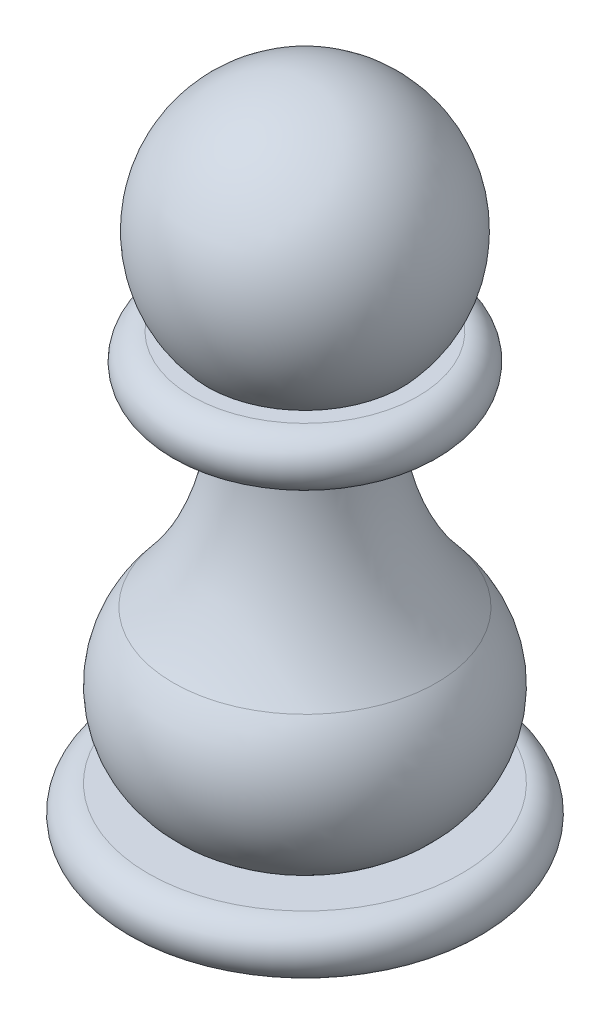
ISO-10303-21;
HEADER;
FILE_DESCRIPTION(('STEP AP214'),'2;1');
FILE_NAME('part.step','',(''),(''),'','','');
FILE_SCHEMA(('AUTOMOTIVE_DESIGN { 1 0 10303 214 1 1 1 1 }'));
ENDSEC;
DATA;
#1=APPLICATION_CONTEXT('core data for automotive mechanical design processes');
#2=APPLICATION_PROTOCOL_DEFINITION('international standard','automotive_design',2000,#1);
#3=PRODUCT_CONTEXT('',#1,'mechanical');
#4=PRODUCT('Part','Part','',(#3));
#5=PRODUCT_RELATED_PRODUCT_CATEGORY('part','',(#4));
#6=PRODUCT_DEFINITION_FORMATION('','',#4);
#7=PRODUCT_DEFINITION_CONTEXT('part definition',#1,'design');
#8=PRODUCT_DEFINITION('design','',#6,#7);
#9=PRODUCT_DEFINITION_SHAPE('','',#8);
#10=(LENGTH_UNIT() NAMED_UNIT(*) SI_UNIT(.MILLI.,.METRE.));
#11=(NAMED_UNIT(*) PLANE_ANGLE_UNIT() SI_UNIT($,.RADIAN.));
#12=(NAMED_UNIT(*) SI_UNIT($,.STERADIAN.) SOLID_ANGLE_UNIT());
#13=UNCERTAINTY_MEASURE_WITH_UNIT(LENGTH_MEASURE(1.E-05),#10,'distance_accuracy_value','');
#14=(GEOMETRIC_REPRESENTATION_CONTEXT(3) GLOBAL_UNCERTAINTY_ASSIGNED_CONTEXT((#13)) GLOBAL_UNIT_ASSIGNED_CONTEXT((#10,
#11,#12)) REPRESENTATION_CONTEXT('',''));
#15=CARTESIAN_POINT('',(0.,0.,0.));
#16=DIRECTION('',(0.,0.,1.));
#17=DIRECTION('',(1.,0.,0.));
#18=AXIS2_PLACEMENT_3D('',#15,#16,#17);
#19=CARTESIAN_POINT('',(0.,-7.5,0.));
#20=DIRECTION('',(0.,1.,0.));
#21=DIRECTION('',(0.,0.,-1.));
#22=AXIS2_PLACEMENT_3D('',#19,#20,#21);
#23=SPHERICAL_SURFACE('',#22,7.5);
#24=CARTESIAN_POINT('',(0.,-12.5,0.));
#25=DIRECTION('',(0.,1.,0.));
#26=DIRECTION('',(0.,0.,1.));
#27=AXIS2_PLACEMENT_3D('',#24,#25,#26);
#28=CIRCLE('',#27,5.59016994374947);
#29=CARTESIAN_POINT('',(0.,-12.5,5.59016994374947));
#30=VERTEX_POINT('',#29);
#31=EDGE_CURVE('E58',#30,#30,#28,.T.);
#32=ORIENTED_EDGE('',*,*,#31,.T.);
#33=EDGE_LOOP('',(#32));
#34=FACE_BOUND('',#33,.T.);
#35=ADVANCED_FACE('F30',(#34),#23,.T.);
#36=CARTESIAN_POINT('',(0.,-38.,0.));
#37=DIRECTION('',(0.,1.,0.));
#38=DIRECTION('',(0.,0.,1.));
#39=AXIS2_PLACEMENT_3D('',#36,#37,#38);
#40=PLANE('',#39);
#41=CARTESIAN_POINT('',(0.,-38.,0.));
#42=DIRECTION('',(0.,1.,0.));
#43=DIRECTION('',(0.,0.,1.));
#44=AXIS2_PLACEMENT_3D('',#41,#42,#43);
#45=CIRCLE('',#44,9.);
#46=CARTESIAN_POINT('',(0.,-38.,8.99999999999999));
#47=VERTEX_POINT('',#46);
#48=EDGE_CURVE('E10',#47,#47,#45,.T.);
#49=ORIENTED_EDGE('',*,*,#48,.F.);
#50=EDGE_LOOP('',(#49));
#51=FACE_BOUND('',#50,.T.);
#52=ADVANCED_FACE('F100',(#51),#40,.F.);
#53=CARTESIAN_POINT('',(0.,-36.5,0.));
#54=DIRECTION('',(0.,1.,0.));
#55=DIRECTION('',(0.,0.,1.));
#56=AXIS2_PLACEMENT_3D('',#53,#54,#55);
#57=TOROIDAL_SURFACE('',#56,9.,1.5);
#58=CARTESIAN_POINT('',(0.,-35.,0.));
#59=DIRECTION('',(0.,1.,0.));
#60=DIRECTION('',(0.,0.,1.));
#61=AXIS2_PLACEMENT_3D('',#58,#59,#60);
#62=CIRCLE('',#61,9.);
#63=CARTESIAN_POINT('',(0.,-35.,9.));
#64=VERTEX_POINT('',#63);
#65=EDGE_CURVE('E36',#64,#64,#62,.T.);
#66=ORIENTED_EDGE('',*,*,#65,.F.);
#67=EDGE_LOOP('',(#66));
#68=FACE_BOUND('',#67,.T.);
#69=ORIENTED_EDGE('',*,*,#48,.T.);
#70=EDGE_LOOP('',(#69));
#71=FACE_BOUND('',#70,.T.);
#72=ADVANCED_FACE('F95',(#68,#71),#57,.T.);
#73=CARTESIAN_POINT('',(0.,-35.,-9.00000000000001));
#74=DIRECTION('',(0.,-1.,0.));
#75=DIRECTION('',(0.,0.,-1.));
#76=AXIS2_PLACEMENT_3D('',#73,#74,#75);
#77=PLANE('',#76);
#78=CARTESIAN_POINT('',(0.,-35.,0.));
#79=DIRECTION('',(0.,1.,0.));
#80=DIRECTION('',(0.,0.,1.));
#81=AXIS2_PLACEMENT_3D('',#78,#79,#80);
#82=CIRCLE('',#81,6.5);
#83=CARTESIAN_POINT('',(0.,-35.,6.5));
#84=VERTEX_POINT('',#83);
#85=EDGE_CURVE('E40',#84,#84,#82,.T.);
#86=ORIENTED_EDGE('',*,*,#85,.F.);
#87=EDGE_LOOP('',(#86));
#88=FACE_BOUND('',#87,.T.);
#89=ORIENTED_EDGE('',*,*,#65,.T.);
#90=EDGE_LOOP('',(#89));
#91=FACE_BOUND('',#90,.T.);
#92=ADVANCED_FACE('F90',(#88,#91),#77,.F.);
#93=CARTESIAN_POINT('',(0.,-30.1266028275955,0.));
#94=DIRECTION('',(0.,1.,0.));
#95=DIRECTION('',(0.,0.,1.));
#96=AXIS2_PLACEMENT_3D('',#93,#94,#95);
#97=DEGENERATE_TOROIDAL_SURFACE('',#96,3.,6.,.T.);
#98=CARTESIAN_POINT('',(0.,-26.2295693766869,0.));
#99=DIRECTION('',(0.,1.,0.));
#100=DIRECTION('',(0.,0.,1.));
#101=AXIS2_PLACEMENT_3D('',#98,#99,#100);
#102=CIRCLE('',#101,7.56214097573703);
#103=CARTESIAN_POINT('',(0.,-26.2295693766869,7.56214097573703));
#104=VERTEX_POINT('',#103);
#105=EDGE_CURVE('E44',#104,#104,#102,.T.);
#106=ORIENTED_EDGE('',*,*,#105,.F.);
#107=EDGE_LOOP('',(#106));
#108=FACE_BOUND('',#107,.T.);
#109=ORIENTED_EDGE('',*,*,#85,.T.);
#110=EDGE_LOOP('',(#109));
#111=FACE_BOUND('',#110,.T.);
#112=ADVANCED_FACE('F84',(#108,#111),#97,.T.);
#113=CARTESIAN_POINT('',(0.,-16.4869857494152,0.));
#114=DIRECTION('',(0.,1.,0.));
#115=DIRECTION('',(0.,0.,1.));
#116=AXIS2_PLACEMENT_3D('',#113,#114,#115);
#117=TOROIDAL_SURFACE('',#116,18.9674934150796,15.);
#118=CARTESIAN_POINT('',(0.,-15.5,0.));
#119=DIRECTION('',(0.,1.,0.));
#120=DIRECTION('',(0.,0.,1.));
#121=AXIS2_PLACEMENT_3D('',#118,#119,#120);
#122=CIRCLE('',#121,4.);
#123=CARTESIAN_POINT('',(0.,-15.5,4.));
#124=VERTEX_POINT('',#123);
#125=EDGE_CURVE('E49',#124,#124,#122,.T.);
#126=ORIENTED_EDGE('',*,*,#125,.F.);
#127=EDGE_LOOP('',(#126));
#128=FACE_BOUND('',#127,.T.);
#129=ORIENTED_EDGE('',*,*,#105,.T.);
#130=EDGE_LOOP('',(#129));
#131=FACE_BOUND('',#130,.T.);
#132=ADVANCED_FACE('F78',(#128,#131),#117,.F.);
#133=CARTESIAN_POINT('',(0.,-15.5,-6.5));
#134=DIRECTION('',(0.,1.,0.));
#135=DIRECTION('',(0.,0.,1.));
#136=AXIS2_PLACEMENT_3D('',#133,#134,#135);
#137=PLANE('',#136);
#138=CARTESIAN_POINT('',(0.,-15.5,0.));
#139=DIRECTION('',(0.,1.,0.));
#140=DIRECTION('',(0.,0.,1.));
#141=AXIS2_PLACEMENT_3D('',#138,#139,#140);
#142=CIRCLE('',#141,6.5);
#143=CARTESIAN_POINT('',(0.,-15.5,6.5));
#144=VERTEX_POINT('',#143);
#145=EDGE_CURVE('E52',#144,#144,#142,.T.);
#146=ORIENTED_EDGE('',*,*,#145,.F.);
#147=EDGE_LOOP('',(#146));
#148=FACE_BOUND('',#147,.T.);
#149=ORIENTED_EDGE('',*,*,#125,.T.);
#150=EDGE_LOOP('',(#149));
#151=FACE_BOUND('',#150,.T.);
#152=ADVANCED_FACE('F72',(#148,#151),#137,.F.);
#153=CARTESIAN_POINT('',(0.,-14.,0.));
#154=DIRECTION('',(0.,1.,0.));
#155=DIRECTION('',(0.,0.,1.));
#156=AXIS2_PLACEMENT_3D('',#153,#154,#155);
#157=TOROIDAL_SURFACE('',#156,6.5,1.5);
#158=CARTESIAN_POINT('',(0.,-12.5,0.));
#159=DIRECTION('',(0.,1.,0.));
#160=DIRECTION('',(0.,0.,1.));
#161=AXIS2_PLACEMENT_3D('',#158,#159,#160);
#162=CIRCLE('',#161,6.5);
#163=CARTESIAN_POINT('',(0.,-12.5,6.5));
#164=VERTEX_POINT('',#163);
#165=EDGE_CURVE('E55',#164,#164,#162,.T.);
#166=ORIENTED_EDGE('',*,*,#165,.F.);
#167=EDGE_LOOP('',(#166));
#168=FACE_BOUND('',#167,.T.);
#169=ORIENTED_EDGE('',*,*,#145,.T.);
#170=EDGE_LOOP('',(#169));
#171=FACE_BOUND('',#170,.T.);
#172=ADVANCED_FACE('F66',(#168,#171),#157,.T.);
#173=CARTESIAN_POINT('',(0.,-12.5,-5.59016994374947));
#174=DIRECTION('',(0.,-1.,0.));
#175=DIRECTION('',(0.,0.,-1.));
#176=AXIS2_PLACEMENT_3D('',#173,#174,#175);
#177=PLANE('',#176);
#178=ORIENTED_EDGE('',*,*,#31,.F.);
#179=EDGE_LOOP('',(#178));
#180=FACE_BOUND('',#179,.T.);
#181=ORIENTED_EDGE('',*,*,#165,.T.);
#182=EDGE_LOOP('',(#181));
#183=FACE_BOUND('',#182,.T.);
#184=ADVANCED_FACE('F63',(#180,#183),#177,.F.);
#185=CLOSED_SHELL('',(#35,#52,#72,#92,#112,#132,#152,#172,#184));
#186=MANIFOLD_SOLID_BREP('B2',#185);
#187=ADVANCED_BREP_SHAPE_REPRESENTATION('',(#18,#186),#14);
#188=SHAPE_DEFINITION_REPRESENTATION(#9,#187);
ENDSEC;
END-ISO-10303-21;
